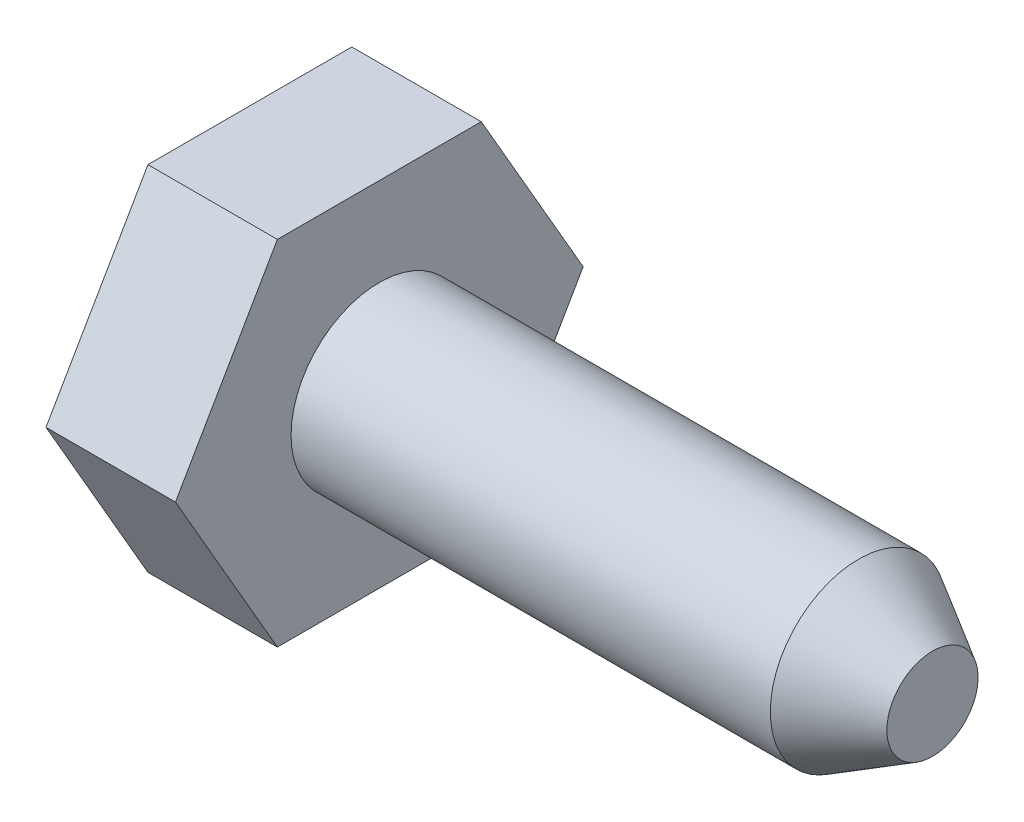
ISO-10303-21;
HEADER;
FILE_DESCRIPTION(('STEP AP214'),'2;1');
FILE_NAME('part.step','',(''),(''),'','','');
FILE_SCHEMA(('AUTOMOTIVE_DESIGN { 1 0 10303 214 1 1 1 1 }'));
ENDSEC;
DATA;
#1=APPLICATION_CONTEXT('core data for automotive mechanical design processes');
#2=APPLICATION_PROTOCOL_DEFINITION('international standard','automotive_design',2000,#1);
#3=PRODUCT_CONTEXT('',#1,'mechanical');
#4=PRODUCT('Part','Part','',(#3));
#5=PRODUCT_RELATED_PRODUCT_CATEGORY('part','',(#4));
#6=PRODUCT_DEFINITION_FORMATION('','',#4);
#7=PRODUCT_DEFINITION_CONTEXT('part definition',#1,'design');
#8=PRODUCT_DEFINITION('design','',#6,#7);
#9=PRODUCT_DEFINITION_SHAPE('','',#8);
#10=(LENGTH_UNIT() NAMED_UNIT(*) SI_UNIT(.MILLI.,.METRE.));
#11=(NAMED_UNIT(*) PLANE_ANGLE_UNIT() SI_UNIT($,.RADIAN.));
#12=(NAMED_UNIT(*) SI_UNIT($,.STERADIAN.) SOLID_ANGLE_UNIT());
#13=UNCERTAINTY_MEASURE_WITH_UNIT(LENGTH_MEASURE(1.E-05),#10,'distance_accuracy_value','');
#14=(GEOMETRIC_REPRESENTATION_CONTEXT(3) GLOBAL_UNCERTAINTY_ASSIGNED_CONTEXT((#13)) GLOBAL_UNIT_ASSIGNED_CONTEXT((#10,
#11,#12)) REPRESENTATION_CONTEXT('',''));
#15=CARTESIAN_POINT('',(0.,0.,0.));
#16=DIRECTION('',(0.,0.,1.));
#17=DIRECTION('',(1.,0.,0.));
#18=AXIS2_PLACEMENT_3D('',#15,#16,#17);
#19=CARTESIAN_POINT('',(0.,0.,0.));
#20=DIRECTION('',(-1.,0.,0.));
#21=DIRECTION('',(0.,0.,1.));
#22=AXIS2_PLACEMENT_3D('',#19,#20,#21);
#23=CYLINDRICAL_SURFACE('',#22,0.762);
#24=CARTESIAN_POINT('',(0.,0.,0.));
#25=DIRECTION('',(-1.,0.,0.));
#26=DIRECTION('',(0.,0.,1.));
#27=AXIS2_PLACEMENT_3D('',#24,#25,#26);
#28=CIRCLE('',#27,0.762);
#29=CARTESIAN_POINT('',(0.,0.,0.762));
#30=VERTEX_POINT('',#29);
#31=EDGE_CURVE('E180',#30,#30,#28,.T.);
#32=ORIENTED_EDGE('',*,*,#31,.F.);
#33=EDGE_LOOP('',(#32));
#34=FACE_BOUND('',#33,.T.);
#35=CARTESIAN_POINT('',(4.13728568757237,0.,0.));
#36=DIRECTION('',(-1.,0.,0.));
#37=DIRECTION('',(0.,0.,1.));
#38=AXIS2_PLACEMENT_3D('',#35,#36,#37);
#39=CIRCLE('',#38,0.762);
#40=CARTESIAN_POINT('',(4.13728568757237,0.,0.762));
#41=VERTEX_POINT('',#40);
#42=EDGE_CURVE('E148',#41,#41,#39,.T.);
#43=ORIENTED_EDGE('',*,*,#42,.T.);
#44=EDGE_LOOP('',(#43));
#45=FACE_BOUND('',#44,.T.);
#46=ADVANCED_FACE('F70',(#34,#45),#23,.T.);
#47=CARTESIAN_POINT('',(-0.89408,1.2192,0.));
#48=DIRECTION('',(1.,0.,0.));
#49=DIRECTION('',(0.,0.,-1.));
#50=AXIS2_PLACEMENT_3D('',#47,#48,#49);
#51=PLANE('',#50);
#52=CARTESIAN_POINT('',(-0.89408,0.,0.));
#53=DIRECTION('',(-1.,0.,0.));
#54=DIRECTION('',(0.,0.,1.));
#55=AXIS2_PLACEMENT_3D('',#52,#53,#54);
#56=CIRCLE('',#55,1.2192);
#57=CARTESIAN_POINT('',(-0.89408,0.,1.2192));
#58=VERTEX_POINT('',#57);
#59=EDGE_CURVE('E44',#58,#58,#56,.T.);
#60=ORIENTED_EDGE('',*,*,#59,.T.);
#61=EDGE_LOOP('',(#60));
#62=FACE_BOUND('',#61,.T.);
#63=ADVANCED_FACE('F72',(#62),#51,.F.);
#64=CARTESIAN_POINT('',(0.,0.,0.));
#65=DIRECTION('',(-1.,0.,0.));
#66=DIRECTION('',(0.,0.,1.));
#67=AXIS2_PLACEMENT_3D('',#64,#65,#66);
#68=CYLINDRICAL_SURFACE('',#67,1.2192);
#69=ORIENTED_EDGE('',*,*,#59,.F.);
#70=EDGE_LOOP('',(#69));
#71=FACE_BOUND('',#70,.T.);
#72=CARTESIAN_POINT('',(-1.1176,0.,0.));
#73=DIRECTION('',(-1.,0.,0.));
#74=DIRECTION('',(0.,0.,1.));
#75=AXIS2_PLACEMENT_3D('',#72,#73,#74);
#76=CIRCLE('',#75,1.2192);
#77=CARTESIAN_POINT('',(-1.1176,0.,1.2192));
#78=VERTEX_POINT('',#77);
#79=EDGE_CURVE('E78',#78,#78,#76,.T.);
#80=ORIENTED_EDGE('',*,*,#79,.T.);
#81=EDGE_LOOP('',(#80));
#82=FACE_BOUND('',#81,.T.);
#83=ADVANCED_FACE('F185',(#71,#82),#68,.F.);
#84=CARTESIAN_POINT('',(-1.1176,1.524,0.));
#85=DIRECTION('',(1.,0.,0.));
#86=DIRECTION('',(0.,0.,-1.));
#87=AXIS2_PLACEMENT_3D('',#84,#85,#86);
#88=PLANE('',#87);
#89=ORIENTED_EDGE('',*,*,#79,.F.);
#90=EDGE_LOOP('',(#89));
#91=FACE_BOUND('',#90,.T.);
#92=DIRECTION('',(0.,-0.866025403784439,0.5));
#93=VECTOR('',#92,1.);
#94=CARTESIAN_POINT('',(-1.1176,-0.762000000000001,-1.31982271536748));
#95=LINE('',#94,#93);
#96=CARTESIAN_POINT('',(-1.1176,0.,-1.75976362048998));
#97=VERTEX_POINT('',#96);
#98=CARTESIAN_POINT('',(-1.1176,-1.524,-0.87988181024499));
#99=VERTEX_POINT('',#98);
#100=EDGE_CURVE('E123',#97,#99,#95,.T.);
#101=ORIENTED_EDGE('',*,*,#100,.T.);
#102=DIRECTION('',(0.,0.,1.));
#103=VECTOR('',#102,1.);
#104=CARTESIAN_POINT('',(-1.1176,-1.524,0.));
#105=LINE('',#104,#103);
#106=CARTESIAN_POINT('',(-1.1176,-1.524,0.879881810244989));
#107=VERTEX_POINT('',#106);
#108=EDGE_CURVE('E127',#99,#107,#105,.T.);
#109=ORIENTED_EDGE('',*,*,#108,.T.);
#110=DIRECTION('',(0.,0.866025403784439,0.5));
#111=VECTOR('',#110,1.);
#112=CARTESIAN_POINT('',(-1.1176,-0.762,1.31982271536748));
#113=LINE('',#112,#111);
#114=CARTESIAN_POINT('',(-1.1176,0.,1.75976362048998));
#115=VERTEX_POINT('',#114);
#116=EDGE_CURVE('E157',#107,#115,#113,.T.);
#117=ORIENTED_EDGE('',*,*,#116,.T.);
#118=DIRECTION('',(0.,0.866025403784439,-0.5));
#119=VECTOR('',#118,1.);
#120=CARTESIAN_POINT('',(-1.1176,0.762,1.31982271536748));
#121=LINE('',#120,#119);
#122=CARTESIAN_POINT('',(-1.1176,1.524,0.879881810244989));
#123=VERTEX_POINT('',#122);
#124=EDGE_CURVE('E163',#115,#123,#121,.T.);
#125=ORIENTED_EDGE('',*,*,#124,.T.);
#126=DIRECTION('',(0.,0.,-1.));
#127=VECTOR('',#126,1.);
#128=CARTESIAN_POINT('',(-1.1176,1.524,0.));
#129=LINE('',#128,#127);
#130=CARTESIAN_POINT('',(-1.1176,1.524,-0.87988181024499));
#131=VERTEX_POINT('',#130);
#132=EDGE_CURVE('E171',#123,#131,#129,.T.);
#133=ORIENTED_EDGE('',*,*,#132,.T.);
#134=DIRECTION('',(0.,-0.866025403784439,-0.5));
#135=VECTOR('',#134,1.);
#136=CARTESIAN_POINT('',(-1.1176,0.762,-1.31982271536748));
#137=LINE('',#136,#135);
#138=EDGE_CURVE('E129',#131,#97,#137,.T.);
#139=ORIENTED_EDGE('',*,*,#138,.T.);
#140=EDGE_LOOP('',(#101,#109,#117,#125,#133,#139));
#141=FACE_BOUND('',#140,.T.);
#142=ADVANCED_FACE('F125',(#91,#141),#88,.F.);
#143=CARTESIAN_POINT('',(0.,0.762,0.));
#144=DIRECTION('',(-1.,0.,0.));
#145=DIRECTION('',(0.,0.,1.));
#146=AXIS2_PLACEMENT_3D('',#143,#144,#145);
#147=PLANE('',#146);
#148=DIRECTION('',(0.,0.,-1.));
#149=VECTOR('',#148,1.);
#150=CARTESIAN_POINT('',(0.,-1.524,0.));
#151=LINE('',#150,#149);
#152=CARTESIAN_POINT('',(0.,-1.524,0.879881810244989));
#153=VERTEX_POINT('',#152);
#154=CARTESIAN_POINT('',(0.,-1.524,-0.87988181024499));
#155=VERTEX_POINT('',#154);
#156=EDGE_CURVE('E141',#153,#155,#151,.T.);
#157=ORIENTED_EDGE('',*,*,#156,.T.);
#158=DIRECTION('',(0.,0.866025403784439,-0.5));
#159=VECTOR('',#158,1.);
#160=CARTESIAN_POINT('',(0.,-0.762000000000001,-1.31982271536748));
#161=LINE('',#160,#159);
#162=CARTESIAN_POINT('',(0.,0.,-1.75976362048998));
#163=VERTEX_POINT('',#162);
#164=EDGE_CURVE('E85',#155,#163,#161,.T.);
#165=ORIENTED_EDGE('',*,*,#164,.T.);
#166=DIRECTION('',(0.,0.866025403784439,0.5));
#167=VECTOR('',#166,1.);
#168=CARTESIAN_POINT('',(0.,0.762,-1.31982271536748));
#169=LINE('',#168,#167);
#170=CARTESIAN_POINT('',(0.,1.524,-0.87988181024499));
#171=VERTEX_POINT('',#170);
#172=EDGE_CURVE('E175',#163,#171,#169,.T.);
#173=ORIENTED_EDGE('',*,*,#172,.T.);
#174=DIRECTION('',(0.,0.,1.));
#175=VECTOR('',#174,1.);
#176=CARTESIAN_POINT('',(0.,1.524,0.));
#177=LINE('',#176,#175);
#178=CARTESIAN_POINT('',(0.,1.524,0.879881810244989));
#179=VERTEX_POINT('',#178);
#180=EDGE_CURVE('E173',#171,#179,#177,.T.);
#181=ORIENTED_EDGE('',*,*,#180,.T.);
#182=DIRECTION('',(0.,-0.866025403784439,0.5));
#183=VECTOR('',#182,1.);
#184=CARTESIAN_POINT('',(0.,0.762,1.31982271536748));
#185=LINE('',#184,#183);
#186=CARTESIAN_POINT('',(0.,0.,1.75976362048998));
#187=VERTEX_POINT('',#186);
#188=EDGE_CURVE('E166',#179,#187,#185,.T.);
#189=ORIENTED_EDGE('',*,*,#188,.T.);
#190=DIRECTION('',(0.,-0.866025403784439,-0.5));
#191=VECTOR('',#190,1.);
#192=CARTESIAN_POINT('',(0.,-0.762,1.31982271536748));
#193=LINE('',#192,#191);
#194=EDGE_CURVE('E154',#187,#153,#193,.T.);
#195=ORIENTED_EDGE('',*,*,#194,.T.);
#196=EDGE_LOOP('',(#157,#165,#173,#181,#189,#195));
#197=FACE_BOUND('',#196,.T.);
#198=ORIENTED_EDGE('',*,*,#31,.T.);
#199=EDGE_LOOP('',(#198));
#200=FACE_BOUND('',#199,.T.);
#201=ADVANCED_FACE('F188',(#197,#200),#147,.F.);
#202=CARTESIAN_POINT('',(1.58622949159319,0.762,-1.31982271536748));
#203=DIRECTION('',(0.,0.5,-0.866025403784439));
#204=DIRECTION('',(0.,0.866025403784439,0.5));
#205=AXIS2_PLACEMENT_3D('',#202,#203,#204);
#206=PLANE('',#205);
#207=ORIENTED_EDGE('',*,*,#172,.F.);
#208=DIRECTION('',(-1.,0.,0.));
#209=VECTOR('',#208,1.);
#210=CARTESIAN_POINT('',(1.58622949159319,0.,-1.75976362048998));
#211=LINE('',#210,#209);
#212=EDGE_CURVE('E92',#163,#97,#211,.T.);
#213=ORIENTED_EDGE('',*,*,#212,.T.);
#214=ORIENTED_EDGE('',*,*,#138,.F.);
#215=DIRECTION('',(-1.,0.,0.));
#216=VECTOR('',#215,1.);
#217=CARTESIAN_POINT('',(1.58622949159319,1.524,-0.87988181024499));
#218=LINE('',#217,#216);
#219=EDGE_CURVE('E168',#171,#131,#218,.T.);
#220=ORIENTED_EDGE('',*,*,#219,.F.);
#221=EDGE_LOOP('',(#207,#213,#214,#220));
#222=FACE_BOUND('',#221,.T.);
#223=ADVANCED_FACE('F194',(#222),#206,.T.);
#224=CARTESIAN_POINT('',(1.58622949159319,-0.762000000000001,-1.31982271536748));
#225=DIRECTION('',(0.,-0.5,-0.866025403784439));
#226=DIRECTION('',(0.,0.866025403784439,-0.5));
#227=AXIS2_PLACEMENT_3D('',#224,#225,#226);
#228=PLANE('',#227);
#229=ORIENTED_EDGE('',*,*,#164,.F.);
#230=DIRECTION('',(-1.,0.,0.));
#231=VECTOR('',#230,1.);
#232=CARTESIAN_POINT('',(1.58622949159319,-1.524,-0.87988181024499));
#233=LINE('',#232,#231);
#234=EDGE_CURVE('E138',#155,#99,#233,.T.);
#235=ORIENTED_EDGE('',*,*,#234,.T.);
#236=ORIENTED_EDGE('',*,*,#100,.F.);
#237=ORIENTED_EDGE('',*,*,#212,.F.);
#238=EDGE_LOOP('',(#229,#235,#236,#237));
#239=FACE_BOUND('',#238,.T.);
#240=ADVANCED_FACE('F143',(#239),#228,.T.);
#241=CARTESIAN_POINT('',(1.58622949159319,1.524,0.));
#242=DIRECTION('',(0.,1.,0.));
#243=DIRECTION('',(0.,0.,1.));
#244=AXIS2_PLACEMENT_3D('',#241,#242,#243);
#245=PLANE('',#244);
#246=ORIENTED_EDGE('',*,*,#180,.F.);
#247=ORIENTED_EDGE('',*,*,#219,.T.);
#248=ORIENTED_EDGE('',*,*,#132,.F.);
#249=DIRECTION('',(-1.,0.,0.));
#250=VECTOR('',#249,1.);
#251=CARTESIAN_POINT('',(1.58622949159319,1.524,0.879881810244989));
#252=LINE('',#251,#250);
#253=EDGE_CURVE('E156',#179,#123,#252,.T.);
#254=ORIENTED_EDGE('',*,*,#253,.F.);
#255=EDGE_LOOP('',(#246,#247,#248,#254));
#256=FACE_BOUND('',#255,.T.);
#257=ADVANCED_FACE('F216',(#256),#245,.T.);
#258=CARTESIAN_POINT('',(1.58622949159319,0.762,1.31982271536748));
#259=DIRECTION('',(0.,0.5,0.866025403784439));
#260=DIRECTION('',(0.,-0.866025403784439,0.5));
#261=AXIS2_PLACEMENT_3D('',#258,#259,#260);
#262=PLANE('',#261);
#263=ORIENTED_EDGE('',*,*,#188,.F.);
#264=ORIENTED_EDGE('',*,*,#253,.T.);
#265=ORIENTED_EDGE('',*,*,#124,.F.);
#266=DIRECTION('',(-1.,0.,0.));
#267=VECTOR('',#266,1.);
#268=CARTESIAN_POINT('',(1.58622949159319,0.,1.75976362048998));
#269=LINE('',#268,#267);
#270=EDGE_CURVE('E153',#187,#115,#269,.T.);
#271=ORIENTED_EDGE('',*,*,#270,.F.);
#272=EDGE_LOOP('',(#263,#264,#265,#271));
#273=FACE_BOUND('',#272,.T.);
#274=ADVANCED_FACE('F219',(#273),#262,.T.);
#275=CARTESIAN_POINT('',(1.58622949159319,-0.762,1.31982271536748));
#276=DIRECTION('',(0.,-0.5,0.866025403784439));
#277=DIRECTION('',(0.,-0.866025403784439,-0.5));
#278=AXIS2_PLACEMENT_3D('',#275,#276,#277);
#279=PLANE('',#278);
#280=ORIENTED_EDGE('',*,*,#194,.F.);
#281=ORIENTED_EDGE('',*,*,#270,.T.);
#282=ORIENTED_EDGE('',*,*,#116,.F.);
#283=DIRECTION('',(-1.,0.,0.));
#284=VECTOR('',#283,1.);
#285=CARTESIAN_POINT('',(1.58622949159319,-1.524,0.879881810244989));
#286=LINE('',#285,#284);
#287=EDGE_CURVE('E140',#153,#107,#286,.T.);
#288=ORIENTED_EDGE('',*,*,#287,.F.);
#289=EDGE_LOOP('',(#280,#281,#282,#288));
#290=FACE_BOUND('',#289,.T.);
#291=ADVANCED_FACE('F223',(#290),#279,.T.);
#292=CARTESIAN_POINT('',(1.58622949159319,-1.524,0.));
#293=DIRECTION('',(0.,-1.,0.));
#294=DIRECTION('',(0.,0.,-1.));
#295=AXIS2_PLACEMENT_3D('',#292,#293,#294);
#296=PLANE('',#295);
#297=ORIENTED_EDGE('',*,*,#156,.F.);
#298=ORIENTED_EDGE('',*,*,#287,.T.);
#299=ORIENTED_EDGE('',*,*,#108,.F.);
#300=ORIENTED_EDGE('',*,*,#234,.F.);
#301=EDGE_LOOP('',(#297,#298,#299,#300));
#302=FACE_BOUND('',#301,.T.);
#303=ADVANCED_FACE('F137',(#302),#296,.T.);
#304=CARTESIAN_POINT('',(4.13728568757237,0.,0.));
#305=DIRECTION('',(-1.,0.,0.));
#306=DIRECTION('',(0.,0.,1.));
#307=AXIS2_PLACEMENT_3D('',#304,#305,#306);
#308=CONICAL_SURFACE('',#307,0.762,0.523598775598292);
#309=CARTESIAN_POINT('',(4.7752,0.,0.));
#310=DIRECTION('',(-1.,0.,0.));
#311=DIRECTION('',(0.,0.,1.));
#312=AXIS2_PLACEMENT_3D('',#309,#310,#311);
#313=CIRCLE('',#312,0.3937);
#314=CARTESIAN_POINT('',(4.7752,0.,0.3937));
#315=VERTEX_POINT('',#314);
#316=EDGE_CURVE('E144',#315,#315,#313,.T.);
#317=ORIENTED_EDGE('',*,*,#316,.T.);
#318=EDGE_LOOP('',(#317));
#319=FACE_BOUND('',#318,.T.);
#320=ORIENTED_EDGE('',*,*,#42,.F.);
#321=EDGE_LOOP('',(#320));
#322=FACE_BOUND('',#321,.T.);
#323=ADVANCED_FACE('F210',(#319,#322),#308,.T.);
#324=CARTESIAN_POINT('',(4.7752,0.762,0.));
#325=DIRECTION('',(-1.,0.,0.));
#326=DIRECTION('',(0.,0.,1.));
#327=AXIS2_PLACEMENT_3D('',#324,#325,#326);
#328=PLANE('',#327);
#329=ORIENTED_EDGE('',*,*,#316,.F.);
#330=EDGE_LOOP('',(#329));
#331=FACE_BOUND('',#330,.T.);
#332=ADVANCED_FACE('F207',(#331),#328,.F.);
#333=CLOSED_SHELL('',(#46,#63,#83,#142,#201,#223,#240,#257,#274,#291,#303,#323,#332));
#334=MANIFOLD_SOLID_BREP('B6',#333);
#335=ADVANCED_BREP_SHAPE_REPRESENTATION('',(#18,#334),#14);
#336=SHAPE_DEFINITION_REPRESENTATION(#9,#335);
ENDSEC;
END-ISO-10303-21;
